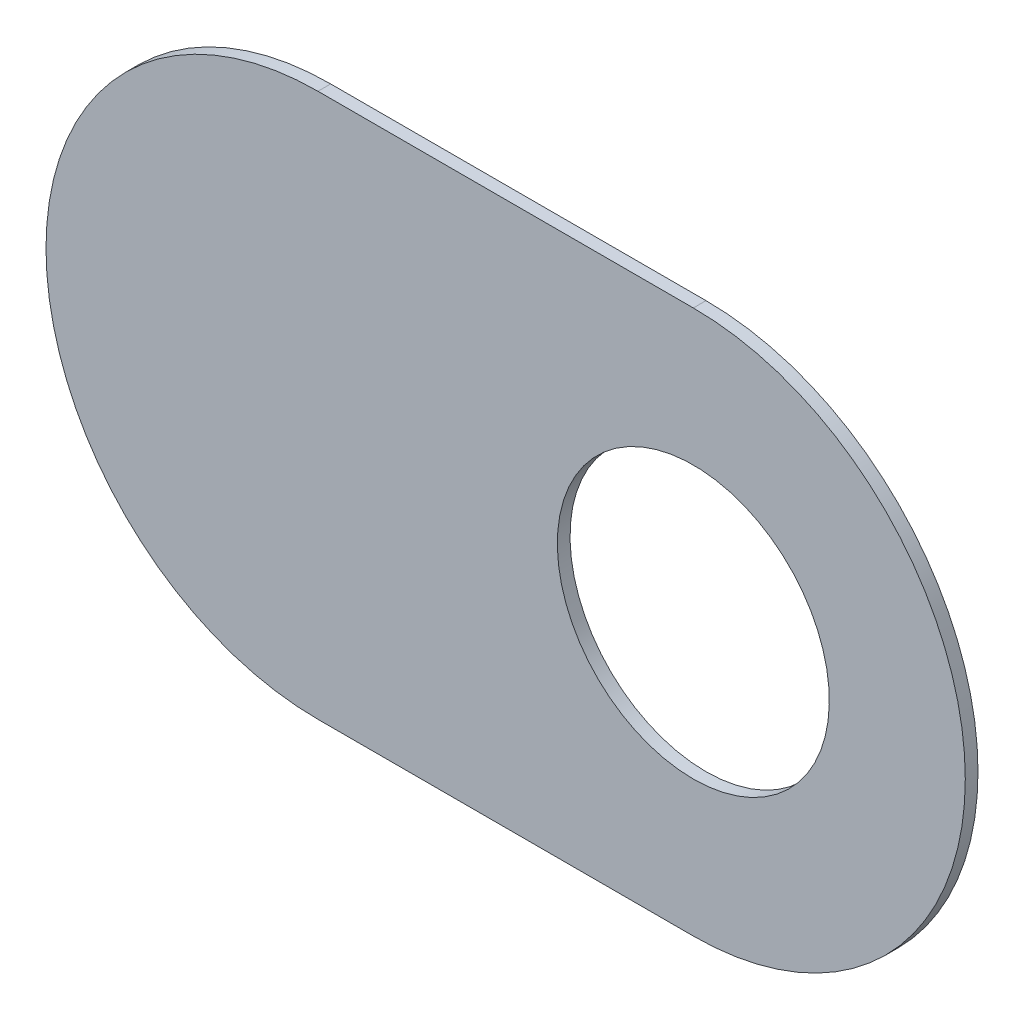
ISO-10303-21;
HEADER;
FILE_DESCRIPTION(('STEP AP214'),'2;1');
FILE_NAME('part.step','',(''),(''),'','','');
FILE_SCHEMA(('AUTOMOTIVE_DESIGN { 1 0 10303 214 1 1 1 1 }'));
ENDSEC;
DATA;
#1=APPLICATION_CONTEXT('core data for automotive mechanical design processes');
#2=APPLICATION_PROTOCOL_DEFINITION('international standard','automotive_design',2000,#1);
#3=PRODUCT_CONTEXT('',#1,'mechanical');
#4=PRODUCT('Part','Part','',(#3));
#5=PRODUCT_RELATED_PRODUCT_CATEGORY('part','',(#4));
#6=PRODUCT_DEFINITION_FORMATION('','',#4);
#7=PRODUCT_DEFINITION_CONTEXT('part definition',#1,'design');
#8=PRODUCT_DEFINITION('design','',#6,#7);
#9=PRODUCT_DEFINITION_SHAPE('','',#8);
#10=(LENGTH_UNIT() NAMED_UNIT(*) SI_UNIT(.MILLI.,.METRE.));
#11=(NAMED_UNIT(*) PLANE_ANGLE_UNIT() SI_UNIT($,.RADIAN.));
#12=(NAMED_UNIT(*) SI_UNIT($,.STERADIAN.) SOLID_ANGLE_UNIT());
#13=UNCERTAINTY_MEASURE_WITH_UNIT(LENGTH_MEASURE(1.E-05),#10,'distance_accuracy_value','');
#14=(GEOMETRIC_REPRESENTATION_CONTEXT(3) GLOBAL_UNCERTAINTY_ASSIGNED_CONTEXT((#13)) GLOBAL_UNIT_ASSIGNED_CONTEXT((#10,
#11,#12)) REPRESENTATION_CONTEXT('',''));
#15=CARTESIAN_POINT('',(0.,0.,0.));
#16=DIRECTION('',(0.,0.,1.));
#17=DIRECTION('',(1.,0.,0.));
#18=AXIS2_PLACEMENT_3D('',#15,#16,#17);
#19=CARTESIAN_POINT('',(21.485,-3.45,-0.045));
#20=DIRECTION('',(0.,0.,-1.));
#21=DIRECTION('',(0.,-1.,0.));
#22=AXIS2_PLACEMENT_3D('',#19,#20,#21);
#23=CYLINDRICAL_SURFACE('',#22,0.375);
#24=CARTESIAN_POINT('',(21.485,-3.45,1.6));
#25=DIRECTION('',(0.,0.,-1.));
#26=DIRECTION('',(0.,-1.,0.));
#27=AXIS2_PLACEMENT_3D('',#24,#25,#26);
#28=CIRCLE('',#27,0.375);
#29=CARTESIAN_POINT('',(21.485,-3.825,1.6));
#30=VERTEX_POINT('',#29);
#31=EDGE_CURVE('E88',#30,#30,#28,.T.);
#32=ORIENTED_EDGE('',*,*,#31,.T.);
#33=DIRECTION('',(0.,0.,1.));
#34=VECTOR('',#33,1.);
#35=CARTESIAN_POINT('',(21.485,-3.825,-0.045));
#36=LINE('',#35,#34);
#37=CARTESIAN_POINT('',(21.485,-3.825,1.635));
#38=VERTEX_POINT('',#37);
#39=EDGE_CURVE('E11',#30,#38,#36,.T.);
#40=ORIENTED_EDGE('',*,*,#39,.T.);
#41=CARTESIAN_POINT('',(21.485,-3.45,1.635));
#42=DIRECTION('',(0.,0.,-1.));
#43=DIRECTION('',(0.,-1.,0.));
#44=AXIS2_PLACEMENT_3D('',#41,#42,#43);
#45=CIRCLE('',#44,0.375);
#46=EDGE_CURVE('E26',#38,#38,#45,.T.);
#47=ORIENTED_EDGE('',*,*,#46,.F.);
#48=ORIENTED_EDGE('',*,*,#39,.F.);
#49=EDGE_LOOP('',(#32,#40,#47,#48));
#50=FACE_BOUND('',#49,.T.);
#51=ADVANCED_FACE('F16',(#50),#23,.F.);
#52=CARTESIAN_POINT('',(20.45,-4.2,1.6));
#53=DIRECTION('',(0.,1.,0.));
#54=DIRECTION('',(1.,0.,0.));
#55=AXIS2_PLACEMENT_3D('',#52,#53,#54);
#56=PLANE('',#55);
#57=DIRECTION('',(1.,0.,0.));
#58=VECTOR('',#57,1.);
#59=CARTESIAN_POINT('',(20.45,-4.2,1.6));
#60=LINE('',#59,#58);
#61=CARTESIAN_POINT('',(20.45,-4.2,1.6));
#62=VERTEX_POINT('',#61);
#63=CARTESIAN_POINT('',(21.485,-4.2,1.6));
#64=VERTEX_POINT('',#63);
#65=EDGE_CURVE('E71',#62,#64,#60,.T.);
#66=ORIENTED_EDGE('',*,*,#65,.T.);
#67=DIRECTION('',(0.,0.,1.));
#68=VECTOR('',#67,1.);
#69=CARTESIAN_POINT('',(21.485,-4.2,1.6));
#70=LINE('',#69,#68);
#71=CARTESIAN_POINT('',(21.485,-4.2,1.635));
#72=VERTEX_POINT('',#71);
#73=EDGE_CURVE('E84',#64,#72,#70,.T.);
#74=ORIENTED_EDGE('',*,*,#73,.T.);
#75=DIRECTION('',(1.,0.,0.));
#76=VECTOR('',#75,1.);
#77=CARTESIAN_POINT('',(20.45,-4.2,1.635));
#78=LINE('',#77,#76);
#79=CARTESIAN_POINT('',(20.45,-4.2,1.635));
#80=VERTEX_POINT('',#79);
#81=EDGE_CURVE('E78',#80,#72,#78,.T.);
#82=ORIENTED_EDGE('',*,*,#81,.F.);
#83=DIRECTION('',(0.,0.,1.));
#84=VECTOR('',#83,1.);
#85=CARTESIAN_POINT('',(20.45,-4.2,1.6));
#86=LINE('',#85,#84);
#87=EDGE_CURVE('E81',#62,#80,#86,.T.);
#88=ORIENTED_EDGE('',*,*,#87,.F.);
#89=EDGE_LOOP('',(#66,#74,#82,#88));
#90=FACE_BOUND('',#89,.T.);
#91=ADVANCED_FACE('F18',(#90),#56,.F.);
#92=CARTESIAN_POINT('',(21.485,-2.7,1.635));
#93=DIRECTION('',(0.,0.,1.));
#94=DIRECTION('',(1.,0.,0.));
#95=AXIS2_PLACEMENT_3D('',#92,#93,#94);
#96=PLANE('',#95);
#97=ORIENTED_EDGE('',*,*,#46,.T.);
#98=EDGE_LOOP('',(#97));
#99=FACE_BOUND('',#98,.T.);
#100=DIRECTION('',(-1.,0.,0.));
#101=VECTOR('',#100,1.);
#102=CARTESIAN_POINT('',(21.485,-2.7,1.635));
#103=LINE('',#102,#101);
#104=CARTESIAN_POINT('',(21.485,-2.7,1.635));
#105=VERTEX_POINT('',#104);
#106=CARTESIAN_POINT('',(20.45,-2.7,1.635));
#107=VERTEX_POINT('',#106);
#108=EDGE_CURVE('E94',#105,#107,#103,.T.);
#109=ORIENTED_EDGE('',*,*,#108,.T.);
#110=CARTESIAN_POINT('',(20.45,-3.45,1.635));
#111=DIRECTION('',(0.,0.,1.));
#112=DIRECTION('',(0.,1.,0.));
#113=AXIS2_PLACEMENT_3D('',#110,#111,#112);
#114=CIRCLE('',#113,0.75);
#115=EDGE_CURVE('E91',#107,#80,#114,.T.);
#116=ORIENTED_EDGE('',*,*,#115,.T.);
#117=ORIENTED_EDGE('',*,*,#81,.T.);
#118=CARTESIAN_POINT('',(21.485,-3.45,1.635));
#119=DIRECTION('',(0.,0.,1.));
#120=DIRECTION('',(0.,-1.,0.));
#121=AXIS2_PLACEMENT_3D('',#118,#119,#120);
#122=CIRCLE('',#121,0.75);
#123=EDGE_CURVE('E120',#72,#105,#122,.T.);
#124=ORIENTED_EDGE('',*,*,#123,.T.);
#125=EDGE_LOOP('',(#109,#116,#117,#124));
#126=FACE_BOUND('',#125,.T.);
#127=ADVANCED_FACE('F92',(#99,#126),#96,.T.);
#128=CARTESIAN_POINT('',(21.485,-2.7,1.6));
#129=DIRECTION('',(0.,0.,1.));
#130=DIRECTION('',(1.,0.,0.));
#131=AXIS2_PLACEMENT_3D('',#128,#129,#130);
#132=PLANE('',#131);
#133=ORIENTED_EDGE('',*,*,#31,.F.);
#134=EDGE_LOOP('',(#133));
#135=FACE_BOUND('',#134,.T.);
#136=CARTESIAN_POINT('',(21.485,-3.45,1.6));
#137=DIRECTION('',(0.,0.,1.));
#138=DIRECTION('',(0.,-1.,0.));
#139=AXIS2_PLACEMENT_3D('',#136,#137,#138);
#140=CIRCLE('',#139,0.75);
#141=CARTESIAN_POINT('',(21.485,-2.7,1.6));
#142=VERTEX_POINT('',#141);
#143=EDGE_CURVE('E111',#64,#142,#140,.T.);
#144=ORIENTED_EDGE('',*,*,#143,.F.);
#145=ORIENTED_EDGE('',*,*,#65,.F.);
#146=CARTESIAN_POINT('',(20.45,-3.45,1.6));
#147=DIRECTION('',(0.,0.,1.));
#148=DIRECTION('',(0.,1.,0.));
#149=AXIS2_PLACEMENT_3D('',#146,#147,#148);
#150=CIRCLE('',#149,0.75);
#151=CARTESIAN_POINT('',(20.45,-2.7,1.6));
#152=VERTEX_POINT('',#151);
#153=EDGE_CURVE('E101',#152,#62,#150,.T.);
#154=ORIENTED_EDGE('',*,*,#153,.F.);
#155=DIRECTION('',(-1.,0.,0.));
#156=VECTOR('',#155,1.);
#157=CARTESIAN_POINT('',(21.485,-2.7,1.6));
#158=LINE('',#157,#156);
#159=EDGE_CURVE('E116',#142,#152,#158,.T.);
#160=ORIENTED_EDGE('',*,*,#159,.F.);
#161=EDGE_LOOP('',(#144,#145,#154,#160));
#162=FACE_BOUND('',#161,.T.);
#163=ADVANCED_FACE('F131',(#135,#162),#132,.F.);
#164=CARTESIAN_POINT('',(20.45,-3.45,1.6));
#165=DIRECTION('',(0.,0.,-1.));
#166=DIRECTION('',(0.,1.,0.));
#167=AXIS2_PLACEMENT_3D('',#164,#165,#166);
#168=CYLINDRICAL_SURFACE('',#167,0.75);
#169=ORIENTED_EDGE('',*,*,#153,.T.);
#170=ORIENTED_EDGE('',*,*,#87,.T.);
#171=ORIENTED_EDGE('',*,*,#115,.F.);
#172=DIRECTION('',(0.,0.,1.));
#173=VECTOR('',#172,1.);
#174=CARTESIAN_POINT('',(20.45,-2.7,1.6));
#175=LINE('',#174,#173);
#176=EDGE_CURVE('E113',#152,#107,#175,.T.);
#177=ORIENTED_EDGE('',*,*,#176,.F.);
#178=EDGE_LOOP('',(#169,#170,#171,#177));
#179=FACE_BOUND('',#178,.T.);
#180=ADVANCED_FACE('F100',(#179),#168,.T.);
#181=CARTESIAN_POINT('',(21.485,-3.45,1.6));
#182=DIRECTION('',(0.,0.,-1.));
#183=DIRECTION('',(0.,-1.,0.));
#184=AXIS2_PLACEMENT_3D('',#181,#182,#183);
#185=CYLINDRICAL_SURFACE('',#184,0.75);
#186=ORIENTED_EDGE('',*,*,#143,.T.);
#187=DIRECTION('',(0.,0.,1.));
#188=VECTOR('',#187,1.);
#189=CARTESIAN_POINT('',(21.485,-2.7,1.6));
#190=LINE('',#189,#188);
#191=EDGE_CURVE('E119',#142,#105,#190,.T.);
#192=ORIENTED_EDGE('',*,*,#191,.T.);
#193=ORIENTED_EDGE('',*,*,#123,.F.);
#194=ORIENTED_EDGE('',*,*,#73,.F.);
#195=EDGE_LOOP('',(#186,#192,#193,#194));
#196=FACE_BOUND('',#195,.T.);
#197=ADVANCED_FACE('F153',(#196),#185,.T.);
#198=CARTESIAN_POINT('',(21.485,-2.7,1.6));
#199=DIRECTION('',(0.,-1.,0.));
#200=DIRECTION('',(0.,0.,-1.));
#201=AXIS2_PLACEMENT_3D('',#198,#199,#200);
#202=PLANE('',#201);
#203=ORIENTED_EDGE('',*,*,#159,.T.);
#204=ORIENTED_EDGE('',*,*,#176,.T.);
#205=ORIENTED_EDGE('',*,*,#108,.F.);
#206=ORIENTED_EDGE('',*,*,#191,.F.);
#207=EDGE_LOOP('',(#203,#204,#205,#206));
#208=FACE_BOUND('',#207,.T.);
#209=ADVANCED_FACE('F151',(#208),#202,.F.);
#210=CLOSED_SHELL('',(#51,#91,#127,#163,#180,#197,#209));
#211=MANIFOLD_SOLID_BREP('B1',#210);
#212=ADVANCED_BREP_SHAPE_REPRESENTATION('',(#18,#211),#14);
#213=SHAPE_DEFINITION_REPRESENTATION(#9,#212);
ENDSEC;
END-ISO-10303-21;
